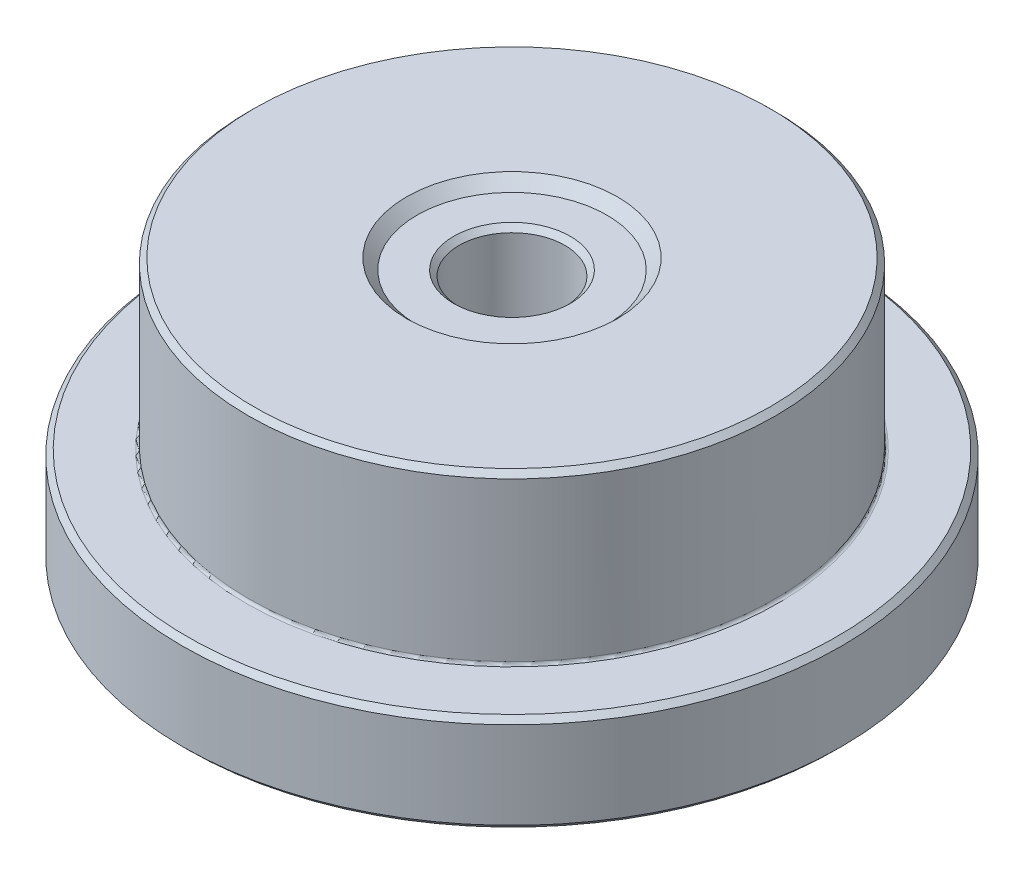
ISO-10303-21;
HEADER;
FILE_DESCRIPTION(('STEP AP214'),'2;1');
FILE_NAME('part.step','',(''),(''),'','','');
FILE_SCHEMA(('AUTOMOTIVE_DESIGN { 1 0 10303 214 1 1 1 1 }'));
ENDSEC;
DATA;
#1=APPLICATION_CONTEXT('core data for automotive mechanical design processes');
#2=APPLICATION_PROTOCOL_DEFINITION('international standard','automotive_design',2000,#1);
#3=PRODUCT_CONTEXT('',#1,'mechanical');
#4=PRODUCT('Part','Part','',(#3));
#5=PRODUCT_RELATED_PRODUCT_CATEGORY('part','',(#4));
#6=PRODUCT_DEFINITION_FORMATION('','',#4);
#7=PRODUCT_DEFINITION_CONTEXT('part definition',#1,'design');
#8=PRODUCT_DEFINITION('design','',#6,#7);
#9=PRODUCT_DEFINITION_SHAPE('','',#8);
#10=(LENGTH_UNIT() NAMED_UNIT(*) SI_UNIT(.MILLI.,.METRE.));
#11=(NAMED_UNIT(*) PLANE_ANGLE_UNIT() SI_UNIT($,.RADIAN.));
#12=(NAMED_UNIT(*) SI_UNIT($,.STERADIAN.) SOLID_ANGLE_UNIT());
#13=UNCERTAINTY_MEASURE_WITH_UNIT(LENGTH_MEASURE(1.E-05),#10,'distance_accuracy_value','');
#14=(GEOMETRIC_REPRESENTATION_CONTEXT(3) GLOBAL_UNCERTAINTY_ASSIGNED_CONTEXT((#13)) GLOBAL_UNIT_ASSIGNED_CONTEXT((#10,
#11,#12)) REPRESENTATION_CONTEXT('',''));
#15=CARTESIAN_POINT('',(0.,0.,0.));
#16=DIRECTION('',(0.,0.,1.));
#17=DIRECTION('',(1.,0.,0.));
#18=AXIS2_PLACEMENT_3D('',#15,#16,#17);
#19=CARTESIAN_POINT('',(5.08,6.35,0.));
#20=DIRECTION('',(0.,-1.,0.));
#21=DIRECTION('',(0.,0.,-1.));
#22=AXIS2_PLACEMENT_3D('',#19,#20,#21);
#23=PLANE('',#22);
#24=CARTESIAN_POINT('',(0.,6.35,0.));
#25=DIRECTION('',(0.,-1.,0.));
#26=DIRECTION('',(1.,0.,0.));
#27=AXIS2_PLACEMENT_3D('',#24,#25,#26);
#28=CIRCLE('',#27,12.4333);
#29=CARTESIAN_POINT('',(12.4333,6.35,0.));
#30=VERTEX_POINT('',#29);
#31=EDGE_CURVE('E55',#30,#30,#28,.T.);
#32=ORIENTED_EDGE('',*,*,#31,.F.);
#33=EDGE_LOOP('',(#32));
#34=FACE_BOUND('',#33,.T.);
#35=CARTESIAN_POINT('',(0.,6.34999999994079,0.));
#36=DIRECTION('',(0.,1.,0.));
#37=DIRECTION('',(0.,0.,1.));
#38=AXIS2_PLACEMENT_3D('',#35,#36,#37);
#39=CIRCLE('',#38,5.08000000002085);
#40=CARTESIAN_POINT('',(0.,6.34999999994079,5.08000000002085));
#41=VERTEX_POINT('',#40);
#42=EDGE_CURVE('E19',#41,#41,#39,.F.);
#43=ORIENTED_EDGE('',*,*,#42,.T.);
#44=EDGE_LOOP('',(#43));
#45=FACE_BOUND('',#44,.T.);
#46=ADVANCED_FACE('F15',(#34,#45),#23,.F.);
#47=CARTESIAN_POINT('',(0.,6.34999999988395,0.));
#48=DIRECTION('',(0.,1.,0.));
#49=DIRECTION('',(0.,0.,1.));
#50=AXIS2_PLACEMENT_3D('',#47,#48,#49);
#51=CONICAL_SURFACE('',#50,5.079999999964,0.785398163397448);
#52=ORIENTED_EDGE('',*,*,#42,.F.);
#53=EDGE_LOOP('',(#52));
#54=FACE_BOUND('',#53,.T.);
#55=CARTESIAN_POINT('',(0.,5.84199999997281,0.));
#56=DIRECTION('',(0.,1.,0.));
#57=DIRECTION('',(0.,0.,1.));
#58=AXIS2_PLACEMENT_3D('',#55,#56,#57);
#59=CIRCLE('',#58,4.57200000005287);
#60=CARTESIAN_POINT('',(0.,5.84199999997281,4.57200000005287));
#61=VERTEX_POINT('',#60);
#62=EDGE_CURVE('E53',#61,#61,#59,.F.);
#63=ORIENTED_EDGE('',*,*,#62,.T.);
#64=EDGE_LOOP('',(#63));
#65=FACE_BOUND('',#64,.T.);
#66=ADVANCED_FACE('F63',(#54,#65),#51,.F.);
#67=CARTESIAN_POINT('',(0.,6.096,0.));
#68=DIRECTION('',(0.,-1.,0.));
#69=DIRECTION('',(1.,0.,0.));
#70=AXIS2_PLACEMENT_3D('',#67,#68,#69);
#71=CONICAL_SURFACE('',#70,12.6873,0.785398163397438);
#72=ORIENTED_EDGE('',*,*,#31,.T.);
#73=EDGE_LOOP('',(#72));
#74=FACE_BOUND('',#73,.T.);
#75=CARTESIAN_POINT('',(0.,6.096,0.));
#76=DIRECTION('',(0.,1.,0.));
#77=DIRECTION('',(0.,0.,1.));
#78=AXIS2_PLACEMENT_3D('',#75,#76,#77);
#79=CIRCLE('',#78,12.6873);
#80=CARTESIAN_POINT('',(0.,6.096,12.6873));
#81=VERTEX_POINT('',#80);
#82=EDGE_CURVE('E31',#81,#81,#79,.F.);
#83=ORIENTED_EDGE('',*,*,#82,.F.);
#84=EDGE_LOOP('',(#83));
#85=FACE_BOUND('',#84,.T.);
#86=ADVANCED_FACE('F66',(#74,#85),#71,.T.);
#87=CARTESIAN_POINT('',(0.,5.842,0.));
#88=DIRECTION('',(0.,-1.,0.));
#89=DIRECTION('',(0.,0.,-1.));
#90=AXIS2_PLACEMENT_3D('',#87,#88,#89);
#91=PLANE('',#90);
#92=ORIENTED_EDGE('',*,*,#62,.F.);
#93=EDGE_LOOP('',(#92));
#94=FACE_BOUND('',#93,.T.);
#95=CARTESIAN_POINT('',(0.,5.84199999997281,0.));
#96=DIRECTION('',(0.,1.,0.));
#97=DIRECTION('',(0.,0.,1.));
#98=AXIS2_PLACEMENT_3D('',#95,#96,#97);
#99=CIRCLE('',#98,2.80670000006467);
#100=CARTESIAN_POINT('',(0.,5.84199999997281,2.80670000006467));
#101=VERTEX_POINT('',#100);
#102=EDGE_CURVE('E49',#101,#101,#99,.F.);
#103=ORIENTED_EDGE('',*,*,#102,.T.);
#104=EDGE_LOOP('',(#103));
#105=FACE_BOUND('',#104,.T.);
#106=ADVANCED_FACE('F70',(#94,#105),#91,.F.);
#107=CARTESIAN_POINT('',(0.,5.842,0.));
#108=DIRECTION('',(0.,1.,0.));
#109=DIRECTION('',(0.,0.,1.));
#110=AXIS2_PLACEMENT_3D('',#107,#108,#109);
#111=CYLINDRICAL_SURFACE('',#110,12.6873);
#112=CARTESIAN_POINT('',(0.,-1.524,0.));
#113=DIRECTION('',(0.,1.,0.));
#114=DIRECTION('',(0.,0.,-1.));
#115=AXIS2_PLACEMENT_3D('',#112,#113,#114);
#116=CIRCLE('',#115,12.6873);
#117=CARTESIAN_POINT('',(0.,-1.524,-12.6873));
#118=VERTEX_POINT('',#117);
#119=EDGE_CURVE('E52',#118,#118,#116,.T.);
#120=ORIENTED_EDGE('',*,*,#119,.T.);
#121=EDGE_LOOP('',(#120));
#122=FACE_BOUND('',#121,.T.);
#123=ORIENTED_EDGE('',*,*,#82,.T.);
#124=EDGE_LOOP('',(#123));
#125=FACE_BOUND('',#124,.T.);
#126=ADVANCED_FACE('F73',(#122,#125),#111,.T.);
#127=CARTESIAN_POINT('',(0.,5.84199999985913,0.));
#128=DIRECTION('',(0.,1.,0.));
#129=DIRECTION('',(0.,0.,1.));
#130=AXIS2_PLACEMENT_3D('',#127,#128,#129);
#131=CONICAL_SURFACE('',#130,2.80669999995098,0.785398163509345);
#132=CARTESIAN_POINT('',(0.,5.588,0.));
#133=DIRECTION('',(0.,1.,0.));
#134=DIRECTION('',(0.,0.,1.));
#135=AXIS2_PLACEMENT_3D('',#132,#133,#134);
#136=CIRCLE('',#135,2.5527);
#137=CARTESIAN_POINT('',(0.,5.588,2.5527));
#138=VERTEX_POINT('',#137);
#139=EDGE_CURVE('E48',#138,#138,#136,.F.);
#140=ORIENTED_EDGE('',*,*,#139,.T.);
#141=EDGE_LOOP('',(#140));
#142=FACE_BOUND('',#141,.T.);
#143=ORIENTED_EDGE('',*,*,#102,.F.);
#144=EDGE_LOOP('',(#143));
#145=FACE_BOUND('',#144,.T.);
#146=ADVANCED_FACE('F77',(#142,#145),#131,.F.);
#147=CARTESIAN_POINT('',(0.,-1.52399999999999,0.));
#148=DIRECTION('',(0.,1.,0.));
#149=DIRECTION('',(0.,0.,1.));
#150=AXIS2_PLACEMENT_3D('',#147,#148,#149);
#151=TOROIDAL_SURFACE('',#150,12.8143,0.127000000000003);
#152=CARTESIAN_POINT('',(0.,-1.651,0.));
#153=DIRECTION('',(0.,1.,0.));
#154=DIRECTION('',(0.,0.,1.));
#155=AXIS2_PLACEMENT_3D('',#152,#153,#154);
#156=CIRCLE('',#155,12.8143);
#157=CARTESIAN_POINT('',(0.,-1.651,12.8143));
#158=VERTEX_POINT('',#157);
#159=EDGE_CURVE('E45',#158,#158,#156,.T.);
#160=ORIENTED_EDGE('',*,*,#159,.T.);
#161=EDGE_LOOP('',(#160));
#162=FACE_BOUND('',#161,.T.);
#163=ORIENTED_EDGE('',*,*,#119,.F.);
#164=EDGE_LOOP('',(#163));
#165=FACE_BOUND('',#164,.T.);
#166=ADVANCED_FACE('F17',(#162,#165),#151,.F.);
#167=CARTESIAN_POINT('',(0.,6.35,0.));
#168=DIRECTION('',(0.,1.,0.));
#169=DIRECTION('',(0.,0.,1.));
#170=AXIS2_PLACEMENT_3D('',#167,#168,#169);
#171=CYLINDRICAL_SURFACE('',#170,2.5527);
#172=CARTESIAN_POINT('',(0.,-5.58799999998882,0.));
#173=DIRECTION('',(0.,-1.,0.));
#174=DIRECTION('',(0.,0.,-1.));
#175=AXIS2_PLACEMENT_3D('',#172,#173,#174);
#176=CIRCLE('',#175,2.55270000002383);
#177=CARTESIAN_POINT('',(0.,-5.58799999998882,-2.55270000002383));
#178=VERTEX_POINT('',#177);
#179=EDGE_CURVE('E44',#178,#178,#176,.T.);
#180=ORIENTED_EDGE('',*,*,#179,.T.);
#181=EDGE_LOOP('',(#180));
#182=FACE_BOUND('',#181,.T.);
#183=ORIENTED_EDGE('',*,*,#139,.F.);
#184=EDGE_LOOP('',(#183));
#185=FACE_BOUND('',#184,.T.);
#186=ADVANCED_FACE('F86',(#182,#185),#171,.F.);
#187=CARTESIAN_POINT('',(12.8143,-1.651,0.));
#188=DIRECTION('',(0.,-1.,0.));
#189=DIRECTION('',(0.,0.,-1.));
#190=AXIS2_PLACEMENT_3D('',#187,#188,#189);
#191=PLANE('',#190);
#192=CARTESIAN_POINT('',(0.,-1.651,0.));
#193=DIRECTION('',(0.,-1.,0.));
#194=DIRECTION('',(0.,0.,-1.));
#195=AXIS2_PLACEMENT_3D('',#192,#193,#194);
#196=CIRCLE('',#195,15.621);
#197=CARTESIAN_POINT('',(0.,-1.651,-15.621));
#198=VERTEX_POINT('',#197);
#199=EDGE_CURVE('E41',#198,#198,#196,.T.);
#200=ORIENTED_EDGE('',*,*,#199,.F.);
#201=EDGE_LOOP('',(#200));
#202=FACE_BOUND('',#201,.T.);
#203=ORIENTED_EDGE('',*,*,#159,.F.);
#204=EDGE_LOOP('',(#203));
#205=FACE_BOUND('',#204,.T.);
#206=ADVANCED_FACE('F123',(#202,#205),#191,.F.);
#207=CARTESIAN_POINT('',(0.,-5.84199999985913,0.));
#208=DIRECTION('',(0.,-1.,0.));
#209=DIRECTION('',(0.,0.,-1.));
#210=AXIS2_PLACEMENT_3D('',#207,#208,#209);
#211=CONICAL_SURFACE('',#210,2.80669999989414,0.785398163397448);
#212=ORIENTED_EDGE('',*,*,#179,.F.);
#213=EDGE_LOOP('',(#212));
#214=FACE_BOUND('',#213,.T.);
#215=CARTESIAN_POINT('',(0.,-5.84199999991597,0.));
#216=DIRECTION('',(0.,-1.,0.));
#217=DIRECTION('',(0.,0.,-1.));
#218=AXIS2_PLACEMENT_3D('',#215,#216,#217);
#219=CIRCLE('',#218,2.80669999995098);
#220=CARTESIAN_POINT('',(0.,-5.84199999991597,-2.80669999995098));
#221=VERTEX_POINT('',#220);
#222=EDGE_CURVE('E38',#221,#221,#219,.T.);
#223=ORIENTED_EDGE('',*,*,#222,.T.);
#224=EDGE_LOOP('',(#223));
#225=FACE_BOUND('',#224,.T.);
#226=ADVANCED_FACE('F119',(#214,#225),#211,.F.);
#227=CARTESIAN_POINT('',(0.,-1.905,0.));
#228=DIRECTION('',(0.,-1.,0.));
#229=DIRECTION('',(0.,0.,-1.));
#230=AXIS2_PLACEMENT_3D('',#227,#228,#229);
#231=CONICAL_SURFACE('',#230,15.875,0.785398163397448);
#232=ORIENTED_EDGE('',*,*,#199,.T.);
#233=EDGE_LOOP('',(#232));
#234=FACE_BOUND('',#233,.T.);
#235=CARTESIAN_POINT('',(0.,-1.905,0.));
#236=DIRECTION('',(0.,1.,0.));
#237=DIRECTION('',(0.,0.,1.));
#238=AXIS2_PLACEMENT_3D('',#235,#236,#237);
#239=CIRCLE('',#238,15.875);
#240=CARTESIAN_POINT('',(0.,-1.905,15.875));
#241=VERTEX_POINT('',#240);
#242=EDGE_CURVE('E37',#241,#241,#239,.F.);
#243=ORIENTED_EDGE('',*,*,#242,.F.);
#244=EDGE_LOOP('',(#243));
#245=FACE_BOUND('',#244,.T.);
#246=ADVANCED_FACE('F115',(#234,#245),#231,.T.);
#247=CARTESIAN_POINT('',(0.,-5.842,0.));
#248=DIRECTION('',(0.,1.,0.));
#249=DIRECTION('',(0.,0.,1.));
#250=AXIS2_PLACEMENT_3D('',#247,#248,#249);
#251=PLANE('',#250);
#252=CARTESIAN_POINT('',(0.,-5.84200000002966,0.));
#253=DIRECTION('',(0.,-1.,0.));
#254=DIRECTION('',(0.,0.,-1.));
#255=AXIS2_PLACEMENT_3D('',#252,#253,#254);
#256=CIRCLE('',#255,4.57200000005287);
#257=CARTESIAN_POINT('',(0.,-5.84200000002966,-4.57200000005287));
#258=VERTEX_POINT('',#257);
#259=EDGE_CURVE('E34',#258,#258,#256,.T.);
#260=ORIENTED_EDGE('',*,*,#259,.T.);
#261=EDGE_LOOP('',(#260));
#262=FACE_BOUND('',#261,.T.);
#263=ORIENTED_EDGE('',*,*,#222,.F.);
#264=EDGE_LOOP('',(#263));
#265=FACE_BOUND('',#264,.T.);
#266=ADVANCED_FACE('F111',(#262,#265),#251,.F.);
#267=CARTESIAN_POINT('',(0.,5.842,0.));
#268=DIRECTION('',(0.,1.,0.));
#269=DIRECTION('',(0.,0.,1.));
#270=AXIS2_PLACEMENT_3D('',#267,#268,#269);
#271=CYLINDRICAL_SURFACE('',#270,15.875);
#272=CARTESIAN_POINT('',(0.,-6.09600000000001,0.));
#273=DIRECTION('',(0.,1.,0.));
#274=DIRECTION('',(-1.,0.,0.));
#275=AXIS2_PLACEMENT_3D('',#272,#273,#274);
#276=CIRCLE('',#275,15.875);
#277=CARTESIAN_POINT('',(-15.875,-6.09600000000001,0.));
#278=VERTEX_POINT('',#277);
#279=EDGE_CURVE('E28',#278,#278,#276,.F.);
#280=ORIENTED_EDGE('',*,*,#279,.F.);
#281=EDGE_LOOP('',(#280));
#282=FACE_BOUND('',#281,.T.);
#283=ORIENTED_EDGE('',*,*,#242,.T.);
#284=EDGE_LOOP('',(#283));
#285=FACE_BOUND('',#284,.T.);
#286=ADVANCED_FACE('F107',(#282,#285),#271,.T.);
#287=CARTESIAN_POINT('',(0.,-6.34999999999764,0.));
#288=DIRECTION('',(0.,-1.,0.));
#289=DIRECTION('',(0.,0.,-1.));
#290=AXIS2_PLACEMENT_3D('',#287,#288,#289);
#291=CONICAL_SURFACE('',#290,5.08000000002084,0.785398163397448);
#292=ORIENTED_EDGE('',*,*,#259,.F.);
#293=EDGE_LOOP('',(#292));
#294=FACE_BOUND('',#293,.T.);
#295=CARTESIAN_POINT('',(0.,-6.34999999999764,0.));
#296=DIRECTION('',(0.,-1.,0.));
#297=DIRECTION('',(0.,0.,-1.));
#298=AXIS2_PLACEMENT_3D('',#295,#296,#297);
#299=CIRCLE('',#298,5.08000000002085);
#300=CARTESIAN_POINT('',(0.,-6.34999999999764,-5.08000000002085));
#301=VERTEX_POINT('',#300);
#302=EDGE_CURVE('E23',#301,#301,#299,.T.);
#303=ORIENTED_EDGE('',*,*,#302,.T.);
#304=EDGE_LOOP('',(#303));
#305=FACE_BOUND('',#304,.T.);
#306=ADVANCED_FACE('F100',(#294,#305),#291,.F.);
#307=CARTESIAN_POINT('',(0.,-6.09600000000001,0.));
#308=DIRECTION('',(0.,1.,0.));
#309=DIRECTION('',(0.,0.,1.));
#310=AXIS2_PLACEMENT_3D('',#307,#308,#309);
#311=CONICAL_SURFACE('',#310,15.875,0.785398163397453);
#312=ORIENTED_EDGE('',*,*,#279,.T.);
#313=EDGE_LOOP('',(#312));
#314=FACE_BOUND('',#313,.T.);
#315=CARTESIAN_POINT('',(0.,-6.35,0.));
#316=DIRECTION('',(0.,1.,0.));
#317=DIRECTION('',(0.,0.,1.));
#318=AXIS2_PLACEMENT_3D('',#315,#316,#317);
#319=CIRCLE('',#318,15.621);
#320=CARTESIAN_POINT('',(0.,-6.35,15.621));
#321=VERTEX_POINT('',#320);
#322=EDGE_CURVE('E10',#321,#321,#319,.T.);
#323=ORIENTED_EDGE('',*,*,#322,.T.);
#324=EDGE_LOOP('',(#323));
#325=FACE_BOUND('',#324,.T.);
#326=ADVANCED_FACE('F94',(#314,#325),#311,.T.);
#327=CARTESIAN_POINT('',(15.875,-6.35,0.));
#328=DIRECTION('',(0.,1.,0.));
#329=DIRECTION('',(0.,0.,1.));
#330=AXIS2_PLACEMENT_3D('',#327,#328,#329);
#331=PLANE('',#330);
#332=ORIENTED_EDGE('',*,*,#322,.F.);
#333=EDGE_LOOP('',(#332));
#334=FACE_BOUND('',#333,.T.);
#335=ORIENTED_EDGE('',*,*,#302,.F.);
#336=EDGE_LOOP('',(#335));
#337=FACE_BOUND('',#336,.T.);
#338=ADVANCED_FACE('F92',(#334,#337),#331,.F.);
#339=CLOSED_SHELL('',(#46,#66,#86,#106,#126,#146,#166,#186,#206,#226,#246,#266,#286,#306,#326,#338));
#340=MANIFOLD_SOLID_BREP('B1',#339);
#341=ADVANCED_BREP_SHAPE_REPRESENTATION('',(#18,#340),#14);
#342=SHAPE_DEFINITION_REPRESENTATION(#9,#341);
ENDSEC;
END-ISO-10303-21;
